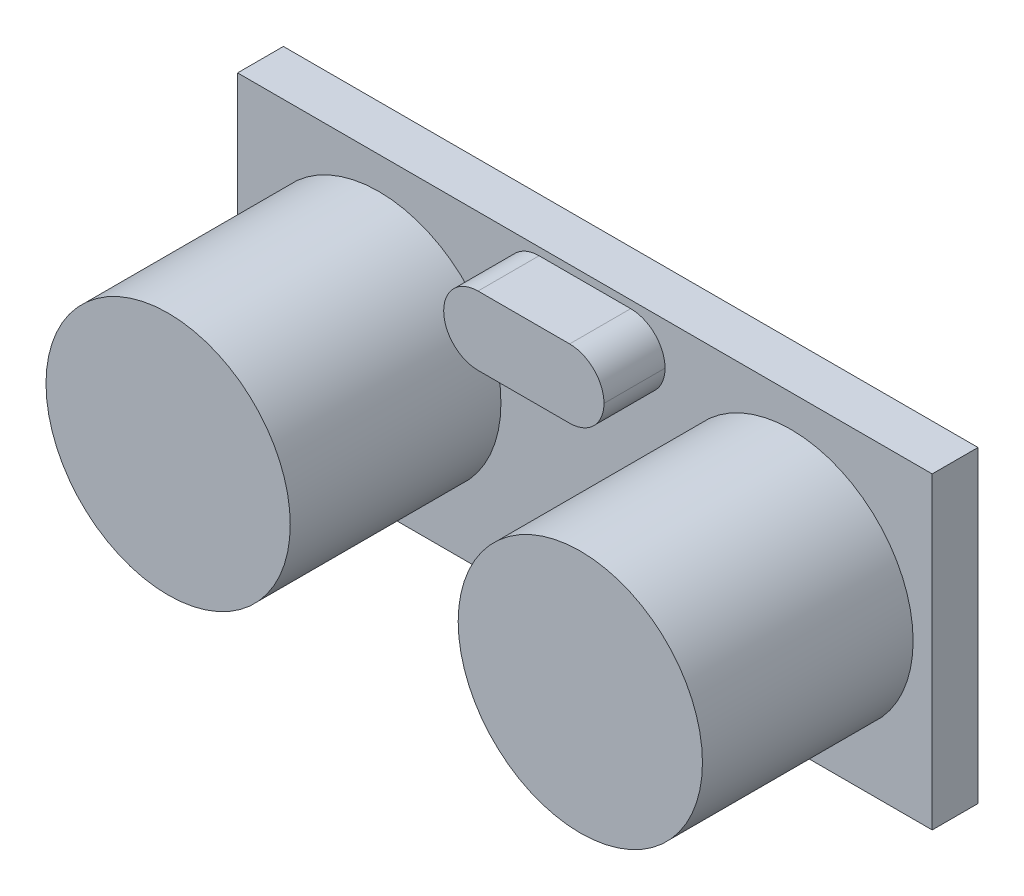
ISO-10303-21;
HEADER;
FILE_DESCRIPTION(('STEP AP214'),'2;1');
FILE_NAME('part.step','',(''),(''),'','','');
FILE_SCHEMA(('AUTOMOTIVE_DESIGN { 1 0 10303 214 1 1 1 1 }'));
ENDSEC;
DATA;
#1=APPLICATION_CONTEXT('core data for automotive mechanical design processes');
#2=APPLICATION_PROTOCOL_DEFINITION('international standard','automotive_design',2000,#1);
#3=PRODUCT_CONTEXT('',#1,'mechanical');
#4=PRODUCT('Part','Part','',(#3));
#5=PRODUCT_RELATED_PRODUCT_CATEGORY('part','',(#4));
#6=PRODUCT_DEFINITION_FORMATION('','',#4);
#7=PRODUCT_DEFINITION_CONTEXT('part definition',#1,'design');
#8=PRODUCT_DEFINITION('design','',#6,#7);
#9=PRODUCT_DEFINITION_SHAPE('','',#8);
#10=(LENGTH_UNIT() NAMED_UNIT(*) SI_UNIT(.MILLI.,.METRE.));
#11=(NAMED_UNIT(*) PLANE_ANGLE_UNIT() SI_UNIT($,.RADIAN.));
#12=(NAMED_UNIT(*) SI_UNIT($,.STERADIAN.) SOLID_ANGLE_UNIT());
#13=UNCERTAINTY_MEASURE_WITH_UNIT(LENGTH_MEASURE(1.E-05),#10,'distance_accuracy_value','');
#14=(GEOMETRIC_REPRESENTATION_CONTEXT(3) GLOBAL_UNCERTAINTY_ASSIGNED_CONTEXT((#13)) GLOBAL_UNIT_ASSIGNED_CONTEXT((#10,
#11,#12)) REPRESENTATION_CONTEXT('',''));
#15=CARTESIAN_POINT('',(0.,0.,0.));
#16=DIRECTION('',(0.,0.,1.));
#17=DIRECTION('',(1.,0.,0.));
#18=AXIS2_PLACEMENT_3D('',#15,#16,#17);
#19=CARTESIAN_POINT('',(0.,0.,3.));
#20=DIRECTION('',(0.,0.,1.));
#21=DIRECTION('',(1.,0.,0.));
#22=AXIS2_PLACEMENT_3D('',#19,#20,#21);
#23=PLANE('',#22);
#24=DIRECTION('',(0.,-1.,0.));
#25=VECTOR('',#24,1.);
#26=CARTESIAN_POINT('',(-5.08,0.,3.));
#27=LINE('',#26,#25);
#28=CARTESIAN_POINT('',(-5.08,-7.56,3.));
#29=VERTEX_POINT('',#28);
#30=CARTESIAN_POINT('',(-5.08,-10.1,3.));
#31=VERTEX_POINT('',#30);
#32=EDGE_CURVE('E210',#29,#31,#27,.T.);
#33=ORIENTED_EDGE('',*,*,#32,.F.);
#34=DIRECTION('',(-1.,0.,0.));
#35=VECTOR('',#34,1.);
#36=CARTESIAN_POINT('',(0.,-7.56,3.));
#37=LINE('',#36,#35);
#38=CARTESIAN_POINT('',(5.08,-7.56,3.));
#39=VERTEX_POINT('',#38);
#40=EDGE_CURVE('E49',#39,#29,#37,.T.);
#41=ORIENTED_EDGE('',*,*,#40,.F.);
#42=DIRECTION('',(0.,1.,0.));
#43=VECTOR('',#42,1.);
#44=CARTESIAN_POINT('',(5.08,0.,3.));
#45=LINE('',#44,#43);
#46=CARTESIAN_POINT('',(5.08,-10.1,3.));
#47=VERTEX_POINT('',#46);
#48=EDGE_CURVE('E53',#47,#39,#45,.T.);
#49=ORIENTED_EDGE('',*,*,#48,.F.);
#50=DIRECTION('',(1.,0.,0.));
#51=VECTOR('',#50,1.);
#52=CARTESIAN_POINT('',(-22.75,-10.1,3.));
#53=LINE('',#52,#51);
#54=CARTESIAN_POINT('',(22.75,-10.1,3.));
#55=VERTEX_POINT('',#54);
#56=EDGE_CURVE('E248',#47,#55,#53,.T.);
#57=ORIENTED_EDGE('',*,*,#56,.T.);
#58=DIRECTION('',(0.,1.,0.));
#59=VECTOR('',#58,1.);
#60=CARTESIAN_POINT('',(22.75,10.1,3.));
#61=LINE('',#60,#59);
#62=CARTESIAN_POINT('',(22.75,10.1,3.));
#63=VERTEX_POINT('',#62);
#64=EDGE_CURVE('E240',#55,#63,#61,.T.);
#65=ORIENTED_EDGE('',*,*,#64,.T.);
#66=DIRECTION('',(-1.,0.,0.));
#67=VECTOR('',#66,1.);
#68=CARTESIAN_POINT('',(-22.75,10.1,3.));
#69=LINE('',#68,#67);
#70=CARTESIAN_POINT('',(-22.75,10.1,3.));
#71=VERTEX_POINT('',#70);
#72=EDGE_CURVE('E243',#63,#71,#69,.T.);
#73=ORIENTED_EDGE('',*,*,#72,.T.);
#74=DIRECTION('',(0.,-1.,0.));
#75=VECTOR('',#74,1.);
#76=CARTESIAN_POINT('',(-22.75,10.1,3.));
#77=LINE('',#76,#75);
#78=CARTESIAN_POINT('',(-22.75,-10.1,3.));
#79=VERTEX_POINT('',#78);
#80=EDGE_CURVE('E246',#71,#79,#77,.T.);
#81=ORIENTED_EDGE('',*,*,#80,.T.);
#82=EDGE_CURVE('E249',#79,#31,#53,.T.);
#83=ORIENTED_EDGE('',*,*,#82,.T.);
#84=EDGE_LOOP('',(#33,#41,#49,#57,#65,#73,#81,#83));
#85=FACE_BOUND('',#84,.T.);
#86=CARTESIAN_POINT('',(13.5,0.,3.));
#87=DIRECTION('',(0.,0.,1.));
#88=DIRECTION('',(1.,0.,0.));
#89=AXIS2_PLACEMENT_3D('',#86,#87,#88);
#90=CIRCLE('',#89,8.);
#91=CARTESIAN_POINT('',(5.5,0.,3.));
#92=VERTEX_POINT('',#91);
#93=EDGE_CURVE('E221',#92,#92,#90,.T.);
#94=ORIENTED_EDGE('',*,*,#93,.F.);
#95=EDGE_LOOP('',(#94));
#96=FACE_BOUND('',#95,.T.);
#97=CARTESIAN_POINT('',(-13.5,0.,3.));
#98=DIRECTION('',(0.,0.,1.));
#99=DIRECTION('',(1.,0.,0.));
#100=AXIS2_PLACEMENT_3D('',#97,#98,#99);
#101=CIRCLE('',#100,8.);
#102=CARTESIAN_POINT('',(-21.5,0.,3.));
#103=VERTEX_POINT('',#102);
#104=EDGE_CURVE('E231',#103,#103,#101,.T.);
#105=ORIENTED_EDGE('',*,*,#104,.F.);
#106=EDGE_LOOP('',(#105));
#107=FACE_BOUND('',#106,.T.);
#108=DIRECTION('',(-1.,0.,0.));
#109=VECTOR('',#108,1.);
#110=CARTESIAN_POINT('',(-5.25,9.6,3.));
#111=LINE('',#110,#109);
#112=CARTESIAN_POINT('',(3.,9.6,3.));
#113=VERTEX_POINT('',#112);
#114=CARTESIAN_POINT('',(-3.,9.6,3.));
#115=VERTEX_POINT('',#114);
#116=EDGE_CURVE('E222',#113,#115,#111,.T.);
#117=ORIENTED_EDGE('',*,*,#116,.F.);
#118=CARTESIAN_POINT('',(3.,7.35,3.));
#119=DIRECTION('',(0.,0.,1.));
#120=DIRECTION('',(1.,0.,0.));
#121=AXIS2_PLACEMENT_3D('',#118,#119,#120);
#122=CIRCLE('',#121,2.25);
#123=CARTESIAN_POINT('',(5.25,7.35,3.));
#124=VERTEX_POINT('',#123);
#125=EDGE_CURVE('E296',#113,#124,#122,.F.);
#126=ORIENTED_EDGE('',*,*,#125,.T.);
#127=CARTESIAN_POINT('',(3.,7.35,3.));
#128=DIRECTION('',(0.,0.,1.));
#129=DIRECTION('',(1.,0.,0.));
#130=AXIS2_PLACEMENT_3D('',#127,#128,#129);
#131=CIRCLE('',#130,2.25);
#132=CARTESIAN_POINT('',(3.,5.1,3.));
#133=VERTEX_POINT('',#132);
#134=EDGE_CURVE('E294',#124,#133,#131,.F.);
#135=ORIENTED_EDGE('',*,*,#134,.T.);
#136=DIRECTION('',(1.,0.,0.));
#137=VECTOR('',#136,1.);
#138=CARTESIAN_POINT('',(-5.25,5.1,3.));
#139=LINE('',#138,#137);
#140=CARTESIAN_POINT('',(-3.,5.1,3.));
#141=VERTEX_POINT('',#140);
#142=EDGE_CURVE('E218',#141,#133,#139,.T.);
#143=ORIENTED_EDGE('',*,*,#142,.F.);
#144=CARTESIAN_POINT('',(-3.,7.35,3.));
#145=DIRECTION('',(0.,0.,1.));
#146=DIRECTION('',(1.,0.,0.));
#147=AXIS2_PLACEMENT_3D('',#144,#145,#146);
#148=CIRCLE('',#147,2.25);
#149=CARTESIAN_POINT('',(-5.25,7.35,3.));
#150=VERTEX_POINT('',#149);
#151=EDGE_CURVE('E290',#141,#150,#148,.F.);
#152=ORIENTED_EDGE('',*,*,#151,.T.);
#153=CARTESIAN_POINT('',(-3.,7.35,3.));
#154=DIRECTION('',(0.,0.,1.));
#155=DIRECTION('',(1.,0.,0.));
#156=AXIS2_PLACEMENT_3D('',#153,#154,#155);
#157=CIRCLE('',#156,2.25);
#158=EDGE_CURVE('E292',#150,#115,#157,.F.);
#159=ORIENTED_EDGE('',*,*,#158,.T.);
#160=EDGE_LOOP('',(#117,#126,#135,#143,#152,#159));
#161=FACE_BOUND('',#160,.T.);
#162=ADVANCED_FACE('F34',(#85,#96,#107,#161),#23,.T.);
#163=CARTESIAN_POINT('',(22.75,10.1,3.));
#164=DIRECTION('',(-1.,0.,0.));
#165=DIRECTION('',(0.,-1.,0.));
#166=AXIS2_PLACEMENT_3D('',#163,#164,#165);
#167=PLANE('',#166);
#168=DIRECTION('',(0.,1.,0.));
#169=VECTOR('',#168,1.);
#170=CARTESIAN_POINT('',(22.75,10.1,0.));
#171=LINE('',#170,#169);
#172=CARTESIAN_POINT('',(22.75,-10.1,0.));
#173=VERTEX_POINT('',#172);
#174=CARTESIAN_POINT('',(22.75,10.1,0.));
#175=VERTEX_POINT('',#174);
#176=EDGE_CURVE('E237',#173,#175,#171,.T.);
#177=ORIENTED_EDGE('',*,*,#176,.T.);
#178=DIRECTION('',(0.,0.,-1.));
#179=VECTOR('',#178,1.);
#180=CARTESIAN_POINT('',(22.75,10.1,3.));
#181=LINE('',#180,#179);
#182=EDGE_CURVE('E269',#63,#175,#181,.T.);
#183=ORIENTED_EDGE('',*,*,#182,.F.);
#184=ORIENTED_EDGE('',*,*,#64,.F.);
#185=DIRECTION('',(0.,0.,-1.));
#186=VECTOR('',#185,1.);
#187=CARTESIAN_POINT('',(22.75,-10.1,3.));
#188=LINE('',#187,#186);
#189=EDGE_CURVE('E251',#55,#173,#188,.T.);
#190=ORIENTED_EDGE('',*,*,#189,.T.);
#191=EDGE_LOOP('',(#177,#183,#184,#190));
#192=FACE_BOUND('',#191,.T.);
#193=ADVANCED_FACE('F338',(#192),#167,.F.);
#194=CARTESIAN_POINT('',(-22.75,10.1,3.));
#195=DIRECTION('',(0.,-1.,0.));
#196=DIRECTION('',(0.,0.,-1.));
#197=AXIS2_PLACEMENT_3D('',#194,#195,#196);
#198=PLANE('',#197);
#199=DIRECTION('',(-1.,0.,0.));
#200=VECTOR('',#199,1.);
#201=CARTESIAN_POINT('',(-22.75,10.1,0.));
#202=LINE('',#201,#200);
#203=CARTESIAN_POINT('',(-22.75,10.1,0.));
#204=VERTEX_POINT('',#203);
#205=EDGE_CURVE('E254',#175,#204,#202,.T.);
#206=ORIENTED_EDGE('',*,*,#205,.T.);
#207=DIRECTION('',(0.,0.,-1.));
#208=VECTOR('',#207,1.);
#209=CARTESIAN_POINT('',(-22.75,10.1,3.));
#210=LINE('',#209,#208);
#211=EDGE_CURVE('E266',#71,#204,#210,.T.);
#212=ORIENTED_EDGE('',*,*,#211,.F.);
#213=ORIENTED_EDGE('',*,*,#72,.F.);
#214=ORIENTED_EDGE('',*,*,#182,.T.);
#215=EDGE_LOOP('',(#206,#212,#213,#214));
#216=FACE_BOUND('',#215,.T.);
#217=ADVANCED_FACE('F340',(#216),#198,.F.);
#218=CARTESIAN_POINT('',(-22.75,10.1,3.));
#219=DIRECTION('',(1.,0.,0.));
#220=DIRECTION('',(0.,1.,0.));
#221=AXIS2_PLACEMENT_3D('',#218,#219,#220);
#222=PLANE('',#221);
#223=DIRECTION('',(0.,-1.,0.));
#224=VECTOR('',#223,1.);
#225=CARTESIAN_POINT('',(-22.75,10.1,0.));
#226=LINE('',#225,#224);
#227=CARTESIAN_POINT('',(-22.75,-10.1,0.));
#228=VERTEX_POINT('',#227);
#229=EDGE_CURVE('E256',#204,#228,#226,.T.);
#230=ORIENTED_EDGE('',*,*,#229,.T.);
#231=DIRECTION('',(0.,0.,-1.));
#232=VECTOR('',#231,1.);
#233=CARTESIAN_POINT('',(-22.75,-10.1,3.));
#234=LINE('',#233,#232);
#235=EDGE_CURVE('E263',#79,#228,#234,.T.);
#236=ORIENTED_EDGE('',*,*,#235,.F.);
#237=ORIENTED_EDGE('',*,*,#80,.F.);
#238=ORIENTED_EDGE('',*,*,#211,.T.);
#239=EDGE_LOOP('',(#230,#236,#237,#238));
#240=FACE_BOUND('',#239,.T.);
#241=ADVANCED_FACE('F318',(#240),#222,.F.);
#242=CARTESIAN_POINT('',(-22.75,-10.1,3.));
#243=DIRECTION('',(0.,1.,0.));
#244=DIRECTION('',(0.,0.,1.));
#245=AXIS2_PLACEMENT_3D('',#242,#243,#244);
#246=PLANE('',#245);
#247=ORIENTED_EDGE('',*,*,#56,.F.);
#248=DIRECTION('',(0.,0.,-1.));
#249=VECTOR('',#248,1.);
#250=CARTESIAN_POINT('',(5.08,-10.1,5.));
#251=LINE('',#250,#249);
#252=CARTESIAN_POINT('',(5.08,-10.1,5.));
#253=VERTEX_POINT('',#252);
#254=EDGE_CURVE('E200',#253,#47,#251,.T.);
#255=ORIENTED_EDGE('',*,*,#254,.F.);
#256=DIRECTION('',(-1.,0.,0.));
#257=VECTOR('',#256,1.);
#258=CARTESIAN_POINT('',(5.08,-10.1,5.));
#259=LINE('',#258,#257);
#260=CARTESIAN_POINT('',(-5.08,-10.1,5.));
#261=VERTEX_POINT('',#260);
#262=EDGE_CURVE('E165',#253,#261,#259,.T.);
#263=ORIENTED_EDGE('',*,*,#262,.T.);
#264=DIRECTION('',(0.,0.,-1.));
#265=VECTOR('',#264,1.);
#266=CARTESIAN_POINT('',(-5.08,-10.1,5.));
#267=LINE('',#266,#265);
#268=EDGE_CURVE('E196',#261,#31,#267,.T.);
#269=ORIENTED_EDGE('',*,*,#268,.T.);
#270=ORIENTED_EDGE('',*,*,#82,.F.);
#271=ORIENTED_EDGE('',*,*,#235,.T.);
#272=DIRECTION('',(1.,0.,0.));
#273=VECTOR('',#272,1.);
#274=CARTESIAN_POINT('',(-22.75,-10.1,0.));
#275=LINE('',#274,#273);
#276=CARTESIAN_POINT('',(-5.08,-10.1,0.));
#277=VERTEX_POINT('',#276);
#278=EDGE_CURVE('E244',#228,#277,#275,.T.);
#279=ORIENTED_EDGE('',*,*,#278,.T.);
#280=CARTESIAN_POINT('',(-5.08,-10.1,-10.));
#281=VERTEX_POINT('',#280);
#282=EDGE_CURVE('E199',#277,#281,#267,.T.);
#283=ORIENTED_EDGE('',*,*,#282,.T.);
#284=DIRECTION('',(-1.,0.,0.));
#285=VECTOR('',#284,1.);
#286=CARTESIAN_POINT('',(5.08,-10.1,-10.));
#287=LINE('',#286,#285);
#288=CARTESIAN_POINT('',(5.08,-10.1,-10.));
#289=VERTEX_POINT('',#288);
#290=EDGE_CURVE('E180',#289,#281,#287,.T.);
#291=ORIENTED_EDGE('',*,*,#290,.F.);
#292=CARTESIAN_POINT('',(5.08,-10.1,0.));
#293=VERTEX_POINT('',#292);
#294=EDGE_CURVE('E203',#293,#289,#251,.T.);
#295=ORIENTED_EDGE('',*,*,#294,.F.);
#296=EDGE_CURVE('E258',#293,#173,#275,.T.);
#297=ORIENTED_EDGE('',*,*,#296,.T.);
#298=ORIENTED_EDGE('',*,*,#189,.F.);
#299=EDGE_LOOP('',(#247,#255,#263,#269,#270,#271,#279,#283,#291,#295,#297,#298));
#300=FACE_BOUND('',#299,.T.);
#301=ADVANCED_FACE('F312',(#300),#246,.F.);
#302=CARTESIAN_POINT('',(0.,0.,0.));
#303=DIRECTION('',(0.,0.,1.));
#304=DIRECTION('',(1.,0.,0.));
#305=AXIS2_PLACEMENT_3D('',#302,#303,#304);
#306=PLANE('',#305);
#307=DIRECTION('',(-1.,0.,0.));
#308=VECTOR('',#307,1.);
#309=CARTESIAN_POINT('',(0.,-7.56,0.));
#310=LINE('',#309,#308);
#311=CARTESIAN_POINT('',(5.08,-7.56,0.));
#312=VERTEX_POINT('',#311);
#313=CARTESIAN_POINT('',(-5.08,-7.56,0.));
#314=VERTEX_POINT('',#313);
#315=EDGE_CURVE('E298',#312,#314,#310,.T.);
#316=ORIENTED_EDGE('',*,*,#315,.T.);
#317=DIRECTION('',(0.,-1.,0.));
#318=VECTOR('',#317,1.);
#319=CARTESIAN_POINT('',(-5.08,0.,0.));
#320=LINE('',#319,#318);
#321=EDGE_CURVE('E11',#314,#277,#320,.T.);
#322=ORIENTED_EDGE('',*,*,#321,.T.);
#323=ORIENTED_EDGE('',*,*,#278,.F.);
#324=ORIENTED_EDGE('',*,*,#229,.F.);
#325=ORIENTED_EDGE('',*,*,#205,.F.);
#326=ORIENTED_EDGE('',*,*,#176,.F.);
#327=ORIENTED_EDGE('',*,*,#296,.F.);
#328=DIRECTION('',(0.,1.,0.));
#329=VECTOR('',#328,1.);
#330=CARTESIAN_POINT('',(5.08,0.,0.));
#331=LINE('',#330,#329);
#332=EDGE_CURVE('E42',#293,#312,#331,.T.);
#333=ORIENTED_EDGE('',*,*,#332,.T.);
#334=EDGE_LOOP('',(#316,#322,#323,#324,#325,#326,#327,#333));
#335=FACE_BOUND('',#334,.T.);
#336=ADVANCED_FACE('F306',(#335),#306,.F.);
#337=CARTESIAN_POINT('',(-13.5,0.,16.8));
#338=DIRECTION('',(0.,0.,-1.));
#339=DIRECTION('',(-1.,0.,0.));
#340=AXIS2_PLACEMENT_3D('',#337,#338,#339);
#341=CYLINDRICAL_SURFACE('',#340,8.);
#342=CARTESIAN_POINT('',(-13.5,0.,16.8));
#343=DIRECTION('',(0.,0.,1.));
#344=DIRECTION('',(1.,0.,0.));
#345=AXIS2_PLACEMENT_3D('',#342,#343,#344);
#346=CIRCLE('',#345,8.);
#347=CARTESIAN_POINT('',(-21.5,0.,16.8));
#348=VERTEX_POINT('',#347);
#349=EDGE_CURVE('E234',#348,#348,#346,.T.);
#350=CARTESIAN_POINT('',(-21.5,0.,16.8));
#351=CARTESIAN_POINT('',(-21.5,0.,16.65625));
#352=CARTESIAN_POINT('',(-21.5,0.,16.5125));
#353=CARTESIAN_POINT('',(-21.5,0.,16.225));
#354=CARTESIAN_POINT('',(-21.5,0.,16.08125));
#355=CARTESIAN_POINT('',(-21.5,0.,15.79375));
#356=CARTESIAN_POINT('',(-21.5,0.,15.65));
#357=CARTESIAN_POINT('',(-21.5,0.,15.3625));
#358=CARTESIAN_POINT('',(-21.5,0.,15.21875));
#359=CARTESIAN_POINT('',(-21.5,0.,14.93125));
#360=CARTESIAN_POINT('',(-21.5,0.,14.7875));
#361=CARTESIAN_POINT('',(-21.5,0.,14.5));
#362=CARTESIAN_POINT('',(-21.5,0.,14.35625));
#363=CARTESIAN_POINT('',(-21.5,0.,14.06875));
#364=CARTESIAN_POINT('',(-21.5,0.,13.925));
#365=CARTESIAN_POINT('',(-21.5,0.,13.6375));
#366=CARTESIAN_POINT('',(-21.5,0.,13.49375));
#367=CARTESIAN_POINT('',(-21.5,0.,13.20625));
#368=CARTESIAN_POINT('',(-21.5,0.,13.0625));
#369=CARTESIAN_POINT('',(-21.5,0.,12.775));
#370=CARTESIAN_POINT('',(-21.5,0.,12.63125));
#371=CARTESIAN_POINT('',(-21.5,0.,12.34375));
#372=CARTESIAN_POINT('',(-21.5,0.,12.2));
#373=CARTESIAN_POINT('',(-21.5,0.,11.9125));
#374=CARTESIAN_POINT('',(-21.5,0.,11.76875));
#375=CARTESIAN_POINT('',(-21.5,0.,11.48125));
#376=CARTESIAN_POINT('',(-21.5,0.,11.3375));
#377=CARTESIAN_POINT('',(-21.5,0.,11.05));
#378=CARTESIAN_POINT('',(-21.5,0.,10.90625));
#379=CARTESIAN_POINT('',(-21.5,0.,10.61875));
#380=CARTESIAN_POINT('',(-21.5,0.,10.475));
#381=CARTESIAN_POINT('',(-21.5,0.,10.1875));
#382=CARTESIAN_POINT('',(-21.5,0.,10.04375));
#383=CARTESIAN_POINT('',(-21.5,0.,9.75625));
#384=CARTESIAN_POINT('',(-21.5,0.,9.6125));
#385=CARTESIAN_POINT('',(-21.5,0.,9.325));
#386=CARTESIAN_POINT('',(-21.5,0.,9.18125));
#387=CARTESIAN_POINT('',(-21.5,0.,8.89375));
#388=CARTESIAN_POINT('',(-21.5,0.,8.75));
#389=CARTESIAN_POINT('',(-21.5,0.,8.4625));
#390=CARTESIAN_POINT('',(-21.5,0.,8.31875));
#391=CARTESIAN_POINT('',(-21.5,0.,8.03125));
#392=CARTESIAN_POINT('',(-21.5,0.,7.8875));
#393=CARTESIAN_POINT('',(-21.5,0.,7.6));
#394=CARTESIAN_POINT('',(-21.5,0.,7.45625));
#395=CARTESIAN_POINT('',(-21.5,0.,7.16875));
#396=CARTESIAN_POINT('',(-21.5,0.,7.025));
#397=CARTESIAN_POINT('',(-21.5,0.,6.7375));
#398=CARTESIAN_POINT('',(-21.5,0.,6.59375));
#399=CARTESIAN_POINT('',(-21.5,0.,6.30625));
#400=CARTESIAN_POINT('',(-21.5,0.,6.1625));
#401=CARTESIAN_POINT('',(-21.5,0.,5.875));
#402=CARTESIAN_POINT('',(-21.5,0.,5.73125));
#403=CARTESIAN_POINT('',(-21.5,0.,5.44375));
#404=CARTESIAN_POINT('',(-21.5,0.,5.3));
#405=CARTESIAN_POINT('',(-21.5,0.,5.0125));
#406=CARTESIAN_POINT('',(-21.5,0.,4.86875));
#407=CARTESIAN_POINT('',(-21.5,0.,4.58125));
#408=CARTESIAN_POINT('',(-21.5,0.,4.4375));
#409=CARTESIAN_POINT('',(-21.5,0.,4.15));
#410=CARTESIAN_POINT('',(-21.5,0.,4.00625));
#411=CARTESIAN_POINT('',(-21.5,0.,3.71875));
#412=CARTESIAN_POINT('',(-21.5,0.,3.575));
#413=CARTESIAN_POINT('',(-21.5,0.,3.2875));
#414=CARTESIAN_POINT('',(-21.5,0.,3.14375));
#415=CARTESIAN_POINT('',(-21.5,0.,3.));
#416=B_SPLINE_CURVE_WITH_KNOTS('',3,(#350,#351,#352,#353,#354,#355,#356,#357,#358,#359,#360,
#361,#362,#363,#364,#365,#366,#367,#368,#369,#370,#371,#372,#373,#374,#375,#376,#377,#378,#379,
#380,#381,#382,#383,#384,#385,#386,#387,#388,#389,#390,#391,#392,#393,#394,#395,#396,#397,#398,
#399,#400,#401,#402,#403,#404,#405,#406,#407,#408,#409,#410,#411,#412,#413,#414,#415),
.UNSPECIFIED.,.F.,.F.,(4,2,2,2,2,2,2,2,2,2,2,2,2,2,2,2,2,2,2,2,2,2,2,2,2,2,2,2,2,2,2,2,4),(0.,
0.431249999999998,0.862499999999999,1.29375,1.725,2.15625,2.5875,3.01875,3.45,3.88125,4.3125,
4.74375,5.175,5.60625,6.0375,6.46875,6.9,7.33125,7.7625,8.19375,8.625,9.05625,9.4875,9.91875,
10.35,10.78125,11.2125,11.64375,12.075,12.50625,12.9375,13.36875,13.8),.UNSPECIFIED.);
#417=EDGE_CURVE('BSEAM355',#348,#103,#416,.T.);
#418=ORIENTED_EDGE('',*,*,#349,.F.);
#419=ORIENTED_EDGE('',*,*,#104,.T.);
#420=ORIENTED_EDGE('',*,*,#417,.T.);
#421=ORIENTED_EDGE('',*,*,#417,.F.);
#422=EDGE_LOOP('',(#418,#420,#419,#421));
#423=FACE_BOUND('',#422,.T.);
#424=ADVANCED_FACE('F355',(#423),#341,.T.);
#425=CARTESIAN_POINT('',(-13.5,0.,16.8));
#426=DIRECTION('',(0.,0.,1.));
#427=DIRECTION('',(1.,0.,0.));
#428=AXIS2_PLACEMENT_3D('',#425,#426,#427);
#429=PLANE('',#428);
#430=ORIENTED_EDGE('',*,*,#349,.T.);
#431=EDGE_LOOP('',(#430));
#432=FACE_BOUND('',#431,.T.);
#433=ADVANCED_FACE('F375',(#432),#429,.T.);
#434=CARTESIAN_POINT('',(13.5,0.,16.8));
#435=DIRECTION('',(0.,0.,-1.));
#436=DIRECTION('',(-1.,0.,0.));
#437=AXIS2_PLACEMENT_3D('',#434,#435,#436);
#438=CYLINDRICAL_SURFACE('',#437,8.);
#439=CARTESIAN_POINT('',(13.5,0.,16.8));
#440=DIRECTION('',(0.,0.,1.));
#441=DIRECTION('',(1.,0.,0.));
#442=AXIS2_PLACEMENT_3D('',#439,#440,#441);
#443=CIRCLE('',#442,8.);
#444=CARTESIAN_POINT('',(5.5,0.,16.8));
#445=VERTEX_POINT('',#444);
#446=EDGE_CURVE('E228',#445,#445,#443,.T.);
#447=CARTESIAN_POINT('',(5.5,0.,16.8));
#448=CARTESIAN_POINT('',(5.5,0.,16.65625));
#449=CARTESIAN_POINT('',(5.5,0.,16.5125));
#450=CARTESIAN_POINT('',(5.5,0.,16.225));
#451=CARTESIAN_POINT('',(5.5,0.,16.08125));
#452=CARTESIAN_POINT('',(5.5,0.,15.79375));
#453=CARTESIAN_POINT('',(5.5,0.,15.65));
#454=CARTESIAN_POINT('',(5.5,0.,15.3625));
#455=CARTESIAN_POINT('',(5.5,0.,15.21875));
#456=CARTESIAN_POINT('',(5.5,0.,14.93125));
#457=CARTESIAN_POINT('',(5.5,0.,14.7875));
#458=CARTESIAN_POINT('',(5.5,0.,14.5));
#459=CARTESIAN_POINT('',(5.5,0.,14.35625));
#460=CARTESIAN_POINT('',(5.5,0.,14.06875));
#461=CARTESIAN_POINT('',(5.5,0.,13.925));
#462=CARTESIAN_POINT('',(5.5,0.,13.6375));
#463=CARTESIAN_POINT('',(5.5,0.,13.49375));
#464=CARTESIAN_POINT('',(5.5,0.,13.20625));
#465=CARTESIAN_POINT('',(5.5,0.,13.0625));
#466=CARTESIAN_POINT('',(5.5,0.,12.775));
#467=CARTESIAN_POINT('',(5.5,0.,12.63125));
#468=CARTESIAN_POINT('',(5.5,0.,12.34375));
#469=CARTESIAN_POINT('',(5.5,0.,12.2));
#470=CARTESIAN_POINT('',(5.5,0.,11.9125));
#471=CARTESIAN_POINT('',(5.5,0.,11.76875));
#472=CARTESIAN_POINT('',(5.5,0.,11.48125));
#473=CARTESIAN_POINT('',(5.5,0.,11.3375));
#474=CARTESIAN_POINT('',(5.5,0.,11.05));
#475=CARTESIAN_POINT('',(5.5,0.,10.90625));
#476=CARTESIAN_POINT('',(5.5,0.,10.61875));
#477=CARTESIAN_POINT('',(5.5,0.,10.475));
#478=CARTESIAN_POINT('',(5.5,0.,10.1875));
#479=CARTESIAN_POINT('',(5.5,0.,10.04375));
#480=CARTESIAN_POINT('',(5.5,0.,9.75625));
#481=CARTESIAN_POINT('',(5.5,0.,9.6125));
#482=CARTESIAN_POINT('',(5.5,0.,9.325));
#483=CARTESIAN_POINT('',(5.5,0.,9.18125));
#484=CARTESIAN_POINT('',(5.5,0.,8.89375));
#485=CARTESIAN_POINT('',(5.5,0.,8.75));
#486=CARTESIAN_POINT('',(5.5,0.,8.4625));
#487=CARTESIAN_POINT('',(5.5,0.,8.31875));
#488=CARTESIAN_POINT('',(5.5,0.,8.03125));
#489=CARTESIAN_POINT('',(5.5,0.,7.8875));
#490=CARTESIAN_POINT('',(5.5,0.,7.6));
#491=CARTESIAN_POINT('',(5.5,0.,7.45625));
#492=CARTESIAN_POINT('',(5.5,0.,7.16875));
#493=CARTESIAN_POINT('',(5.5,0.,7.025));
#494=CARTESIAN_POINT('',(5.5,0.,6.7375));
#495=CARTESIAN_POINT('',(5.5,0.,6.59375));
#496=CARTESIAN_POINT('',(5.5,0.,6.30625));
#497=CARTESIAN_POINT('',(5.5,0.,6.1625));
#498=CARTESIAN_POINT('',(5.5,0.,5.875));
#499=CARTESIAN_POINT('',(5.5,0.,5.73125));
#500=CARTESIAN_POINT('',(5.5,0.,5.44375));
#501=CARTESIAN_POINT('',(5.5,0.,5.3));
#502=CARTESIAN_POINT('',(5.5,0.,5.0125));
#503=CARTESIAN_POINT('',(5.5,0.,4.86875));
#504=CARTESIAN_POINT('',(5.5,0.,4.58125));
#505=CARTESIAN_POINT('',(5.5,0.,4.4375));
#506=CARTESIAN_POINT('',(5.5,0.,4.15));
#507=CARTESIAN_POINT('',(5.5,0.,4.00625));
#508=CARTESIAN_POINT('',(5.5,0.,3.71875));
#509=CARTESIAN_POINT('',(5.5,0.,3.575));
#510=CARTESIAN_POINT('',(5.5,0.,3.2875));
#511=CARTESIAN_POINT('',(5.5,0.,3.14375));
#512=CARTESIAN_POINT('',(5.5,0.,3.));
#513=B_SPLINE_CURVE_WITH_KNOTS('',3,(#447,#448,#449,#450,#451,#452,#453,#454,#455,#456,#457,
#458,#459,#460,#461,#462,#463,#464,#465,#466,#467,#468,#469,#470,#471,#472,#473,#474,#475,#476,
#477,#478,#479,#480,#481,#482,#483,#484,#485,#486,#487,#488,#489,#490,#491,#492,#493,#494,#495,
#496,#497,#498,#499,#500,#501,#502,#503,#504,#505,#506,#507,#508,#509,#510,#511,#512),
.UNSPECIFIED.,.F.,.F.,(4,2,2,2,2,2,2,2,2,2,2,2,2,2,2,2,2,2,2,2,2,2,2,2,2,2,2,2,2,2,2,2,4),(0.,
0.431249999999998,0.862499999999999,1.29375,1.725,2.15625,2.5875,3.01875,3.45,3.88125,4.3125,
4.74375,5.175,5.60625,6.0375,6.46875,6.9,7.33125,7.7625,8.19375,8.625,9.05625,9.4875,9.91875,
10.35,10.78125,11.2125,11.64375,12.075,12.50625,12.9375,13.36875,13.8),.UNSPECIFIED.);
#514=EDGE_CURVE('BSEAM382',#445,#92,#513,.T.);
#515=ORIENTED_EDGE('',*,*,#446,.F.);
#516=ORIENTED_EDGE('',*,*,#93,.T.);
#517=ORIENTED_EDGE('',*,*,#514,.T.);
#518=ORIENTED_EDGE('',*,*,#514,.F.);
#519=EDGE_LOOP('',(#515,#517,#516,#518));
#520=FACE_BOUND('',#519,.T.);
#521=ADVANCED_FACE('F382',(#520),#438,.T.);
#522=CARTESIAN_POINT('',(13.5,0.,16.8));
#523=DIRECTION('',(0.,0.,1.));
#524=DIRECTION('',(1.,0.,0.));
#525=AXIS2_PLACEMENT_3D('',#522,#523,#524);
#526=PLANE('',#525);
#527=ORIENTED_EDGE('',*,*,#446,.T.);
#528=EDGE_LOOP('',(#527));
#529=FACE_BOUND('',#528,.T.);
#530=ADVANCED_FACE('F389',(#529),#526,.T.);
#531=CARTESIAN_POINT('',(-5.25,9.6,7.));
#532=DIRECTION('',(0.,-1.,0.));
#533=DIRECTION('',(0.,0.,-1.));
#534=AXIS2_PLACEMENT_3D('',#531,#532,#533);
#535=PLANE('',#534);
#536=ORIENTED_EDGE('',*,*,#116,.T.);
#537=DIRECTION('',(0.,0.,-1.));
#538=VECTOR('',#537,1.);
#539=CARTESIAN_POINT('',(-3.,9.6,7.));
#540=LINE('',#539,#538);
#541=CARTESIAN_POINT('',(-3.,9.6,7.));
#542=VERTEX_POINT('',#541);
#543=EDGE_CURVE('E288',#115,#542,#540,.F.);
#544=ORIENTED_EDGE('',*,*,#543,.T.);
#545=DIRECTION('',(-1.,0.,0.));
#546=VECTOR('',#545,1.);
#547=CARTESIAN_POINT('',(-5.25,9.6,7.));
#548=LINE('',#547,#546);
#549=CARTESIAN_POINT('',(3.,9.6,7.));
#550=VERTEX_POINT('',#549);
#551=EDGE_CURVE('E214',#550,#542,#548,.T.);
#552=ORIENTED_EDGE('',*,*,#551,.F.);
#553=DIRECTION('',(0.,0.,-1.));
#554=VECTOR('',#553,1.);
#555=CARTESIAN_POINT('',(3.,9.6,7.));
#556=LINE('',#555,#554);
#557=EDGE_CURVE('E286',#550,#113,#556,.T.);
#558=ORIENTED_EDGE('',*,*,#557,.T.);
#559=EDGE_LOOP('',(#536,#544,#552,#558));
#560=FACE_BOUND('',#559,.T.);
#561=ADVANCED_FACE('F397',(#560),#535,.F.);
#562=CARTESIAN_POINT('',(-5.25,5.1,7.));
#563=DIRECTION('',(0.,1.,0.));
#564=DIRECTION('',(0.,0.,1.));
#565=AXIS2_PLACEMENT_3D('',#562,#563,#564);
#566=PLANE('',#565);
#567=DIRECTION('',(1.,0.,0.));
#568=VECTOR('',#567,1.);
#569=CARTESIAN_POINT('',(-5.25,5.1,7.));
#570=LINE('',#569,#568);
#571=CARTESIAN_POINT('',(-3.,5.1,7.));
#572=VERTEX_POINT('',#571);
#573=CARTESIAN_POINT('',(3.,5.1,7.));
#574=VERTEX_POINT('',#573);
#575=EDGE_CURVE('E217',#572,#574,#570,.T.);
#576=ORIENTED_EDGE('',*,*,#575,.F.);
#577=DIRECTION('',(0.,0.,-1.));
#578=VECTOR('',#577,1.);
#579=CARTESIAN_POINT('',(-3.,5.1,7.));
#580=LINE('',#579,#578);
#581=EDGE_CURVE('E275',#572,#141,#580,.T.);
#582=ORIENTED_EDGE('',*,*,#581,.T.);
#583=ORIENTED_EDGE('',*,*,#142,.T.);
#584=DIRECTION('',(0.,0.,-1.));
#585=VECTOR('',#584,1.);
#586=CARTESIAN_POINT('',(3.,5.1,7.));
#587=LINE('',#586,#585);
#588=EDGE_CURVE('E272',#133,#574,#587,.F.);
#589=ORIENTED_EDGE('',*,*,#588,.T.);
#590=EDGE_LOOP('',(#576,#582,#583,#589));
#591=FACE_BOUND('',#590,.T.);
#592=ADVANCED_FACE('F405',(#591),#566,.F.);
#593=CARTESIAN_POINT('',(0.,0.,7.));
#594=DIRECTION('',(0.,0.,1.));
#595=DIRECTION('',(1.,0.,0.));
#596=AXIS2_PLACEMENT_3D('',#593,#594,#595);
#597=PLANE('',#596);
#598=CARTESIAN_POINT('',(-3.,7.35,7.));
#599=DIRECTION('',(0.,0.,1.));
#600=DIRECTION('',(1.,0.,0.));
#601=AXIS2_PLACEMENT_3D('',#598,#599,#600);
#602=CIRCLE('',#601,2.25);
#603=CARTESIAN_POINT('',(-5.25,7.35,7.));
#604=VERTEX_POINT('',#603);
#605=EDGE_CURVE('E282',#542,#604,#602,.T.);
#606=ORIENTED_EDGE('',*,*,#605,.T.);
#607=CARTESIAN_POINT('',(-3.,7.35,7.));
#608=DIRECTION('',(0.,0.,1.));
#609=DIRECTION('',(1.,0.,0.));
#610=AXIS2_PLACEMENT_3D('',#607,#608,#609);
#611=CIRCLE('',#610,2.25);
#612=EDGE_CURVE('E284',#604,#572,#611,.T.);
#613=ORIENTED_EDGE('',*,*,#612,.T.);
#614=ORIENTED_EDGE('',*,*,#575,.T.);
#615=CARTESIAN_POINT('',(3.,7.35,7.));
#616=DIRECTION('',(0.,0.,1.));
#617=DIRECTION('',(1.,0.,0.));
#618=AXIS2_PLACEMENT_3D('',#615,#616,#617);
#619=CIRCLE('',#618,2.25);
#620=CARTESIAN_POINT('',(5.25,7.35,7.));
#621=VERTEX_POINT('',#620);
#622=EDGE_CURVE('E280',#574,#621,#619,.T.);
#623=ORIENTED_EDGE('',*,*,#622,.T.);
#624=CARTESIAN_POINT('',(3.,7.35,7.));
#625=DIRECTION('',(0.,0.,1.));
#626=DIRECTION('',(1.,0.,0.));
#627=AXIS2_PLACEMENT_3D('',#624,#625,#626);
#628=CIRCLE('',#627,2.25);
#629=EDGE_CURVE('E278',#621,#550,#628,.T.);
#630=ORIENTED_EDGE('',*,*,#629,.T.);
#631=ORIENTED_EDGE('',*,*,#551,.T.);
#632=EDGE_LOOP('',(#606,#613,#614,#623,#630,#631));
#633=FACE_BOUND('',#632,.T.);
#634=ADVANCED_FACE('F413',(#633),#597,.T.);
#635=CARTESIAN_POINT('',(-3.,7.35,7.));
#636=DIRECTION('',(0.,0.,-1.));
#637=DIRECTION('',(-1.,0.,0.));
#638=AXIS2_PLACEMENT_3D('',#635,#636,#637);
#639=CYLINDRICAL_SURFACE('',#638,2.25);
#640=DIRECTION('',(0.,0.,-1.));
#641=VECTOR('',#640,1.);
#642=CARTESIAN_POINT('',(-5.25,7.35,7.));
#643=LINE('',#642,#641);
#644=EDGE_CURVE('E225',#604,#150,#643,.T.);
#645=ORIENTED_EDGE('',*,*,#644,.F.);
#646=ORIENTED_EDGE('',*,*,#605,.F.);
#647=ORIENTED_EDGE('',*,*,#543,.F.);
#648=ORIENTED_EDGE('',*,*,#158,.F.);
#649=EDGE_LOOP('',(#645,#646,#647,#648));
#650=FACE_BOUND('',#649,.T.);
#651=ADVANCED_FACE('F421',(#650),#639,.T.);
#652=CARTESIAN_POINT('',(-3.,7.35,7.));
#653=DIRECTION('',(0.,0.,-1.));
#654=DIRECTION('',(-1.,0.,0.));
#655=AXIS2_PLACEMENT_3D('',#652,#653,#654);
#656=CYLINDRICAL_SURFACE('',#655,2.25);
#657=ORIENTED_EDGE('',*,*,#612,.F.);
#658=ORIENTED_EDGE('',*,*,#644,.T.);
#659=ORIENTED_EDGE('',*,*,#151,.F.);
#660=ORIENTED_EDGE('',*,*,#581,.F.);
#661=EDGE_LOOP('',(#657,#658,#659,#660));
#662=FACE_BOUND('',#661,.T.);
#663=ADVANCED_FACE('F429',(#662),#656,.T.);
#664=CARTESIAN_POINT('',(3.,7.35,7.));
#665=DIRECTION('',(0.,0.,-1.));
#666=DIRECTION('',(-1.,0.,0.));
#667=AXIS2_PLACEMENT_3D('',#664,#665,#666);
#668=CYLINDRICAL_SURFACE('',#667,2.25);
#669=ORIENTED_EDGE('',*,*,#557,.F.);
#670=ORIENTED_EDGE('',*,*,#629,.F.);
#671=DIRECTION('',(0.,0.,-1.));
#672=VECTOR('',#671,1.);
#673=CARTESIAN_POINT('',(5.25,7.35,7.));
#674=LINE('',#673,#672);
#675=EDGE_CURVE('E213',#124,#621,#674,.F.);
#676=ORIENTED_EDGE('',*,*,#675,.F.);
#677=ORIENTED_EDGE('',*,*,#125,.F.);
#678=EDGE_LOOP('',(#669,#670,#676,#677));
#679=FACE_BOUND('',#678,.T.);
#680=ADVANCED_FACE('F36',(#679),#668,.T.);
#681=CARTESIAN_POINT('',(3.,7.35,7.));
#682=DIRECTION('',(0.,0.,-1.));
#683=DIRECTION('',(-1.,0.,0.));
#684=AXIS2_PLACEMENT_3D('',#681,#682,#683);
#685=CYLINDRICAL_SURFACE('',#684,2.25);
#686=ORIENTED_EDGE('',*,*,#622,.F.);
#687=ORIENTED_EDGE('',*,*,#588,.F.);
#688=ORIENTED_EDGE('',*,*,#134,.F.);
#689=ORIENTED_EDGE('',*,*,#675,.T.);
#690=EDGE_LOOP('',(#686,#687,#688,#689));
#691=FACE_BOUND('',#690,.T.);
#692=ADVANCED_FACE('F444',(#691),#685,.T.);
#693=CARTESIAN_POINT('',(0.,0.,-10.));
#694=DIRECTION('',(0.,0.,-1.));
#695=DIRECTION('',(-1.,0.,0.));
#696=AXIS2_PLACEMENT_3D('',#693,#694,#695);
#697=PLANE('',#696);
#698=DIRECTION('',(0.,1.,0.));
#699=VECTOR('',#698,1.);
#700=CARTESIAN_POINT('',(-5.08,-7.56,-10.));
#701=LINE('',#700,#699);
#702=CARTESIAN_POINT('',(-5.08,-7.56,-10.));
#703=VERTEX_POINT('',#702);
#704=EDGE_CURVE('E161',#281,#703,#701,.T.);
#705=ORIENTED_EDGE('',*,*,#704,.T.);
#706=DIRECTION('',(1.,0.,0.));
#707=VECTOR('',#706,1.);
#708=CARTESIAN_POINT('',(5.08,-7.56,-10.));
#709=LINE('',#708,#707);
#710=CARTESIAN_POINT('',(5.08,-7.56,-10.));
#711=VERTEX_POINT('',#710);
#712=EDGE_CURVE('E168',#703,#711,#709,.T.);
#713=ORIENTED_EDGE('',*,*,#712,.T.);
#714=DIRECTION('',(0.,-1.,0.));
#715=VECTOR('',#714,1.);
#716=CARTESIAN_POINT('',(5.08,-7.56,-10.));
#717=LINE('',#716,#715);
#718=EDGE_CURVE('E175',#711,#289,#717,.T.);
#719=ORIENTED_EDGE('',*,*,#718,.T.);
#720=ORIENTED_EDGE('',*,*,#290,.T.);
#721=EDGE_LOOP('',(#705,#713,#719,#720));
#722=FACE_BOUND('',#721,.T.);
#723=ADVANCED_FACE('F178',(#722),#697,.T.);
#724=CARTESIAN_POINT('',(5.08,-7.56,5.));
#725=DIRECTION('',(0.,1.,0.));
#726=DIRECTION('',(0.,0.,1.));
#727=AXIS2_PLACEMENT_3D('',#724,#725,#726);
#728=PLANE('',#727);
#729=ORIENTED_EDGE('',*,*,#315,.F.);
#730=DIRECTION('',(0.,0.,-1.));
#731=VECTOR('',#730,1.);
#732=CARTESIAN_POINT('',(5.08,-7.56,5.));
#733=LINE('',#732,#731);
#734=EDGE_CURVE('E171',#312,#711,#733,.T.);
#735=ORIENTED_EDGE('',*,*,#734,.T.);
#736=ORIENTED_EDGE('',*,*,#712,.F.);
#737=DIRECTION('',(0.,0.,-1.));
#738=VECTOR('',#737,1.);
#739=CARTESIAN_POINT('',(-5.08,-7.56,5.));
#740=LINE('',#739,#738);
#741=EDGE_CURVE('E157',#314,#703,#740,.T.);
#742=ORIENTED_EDGE('',*,*,#741,.F.);
#743=EDGE_LOOP('',(#729,#735,#736,#742));
#744=FACE_BOUND('',#743,.T.);
#745=ADVANCED_FACE('F169',(#744),#728,.T.);
#746=CARTESIAN_POINT('',(5.08,-7.56,5.));
#747=DIRECTION('',(1.,0.,0.));
#748=DIRECTION('',(0.,0.,-1.));
#749=AXIS2_PLACEMENT_3D('',#746,#747,#748);
#750=PLANE('',#749);
#751=ORIENTED_EDGE('',*,*,#332,.F.);
#752=ORIENTED_EDGE('',*,*,#294,.T.);
#753=ORIENTED_EDGE('',*,*,#718,.F.);
#754=ORIENTED_EDGE('',*,*,#734,.F.);
#755=EDGE_LOOP('',(#751,#752,#753,#754));
#756=FACE_BOUND('',#755,.T.);
#757=ADVANCED_FACE('F310',(#756),#750,.T.);
#758=CARTESIAN_POINT('',(-5.08,-7.56,5.));
#759=DIRECTION('',(-1.,0.,0.));
#760=DIRECTION('',(0.,0.,1.));
#761=AXIS2_PLACEMENT_3D('',#758,#759,#760);
#762=PLANE('',#761);
#763=ORIENTED_EDGE('',*,*,#321,.F.);
#764=ORIENTED_EDGE('',*,*,#741,.T.);
#765=ORIENTED_EDGE('',*,*,#704,.F.);
#766=ORIENTED_EDGE('',*,*,#282,.F.);
#767=EDGE_LOOP('',(#763,#764,#765,#766));
#768=FACE_BOUND('',#767,.T.);
#769=ADVANCED_FACE('F159',(#768),#762,.T.);
#770=CARTESIAN_POINT('',(-5.08,-7.56,5.));
#771=VERTEX_POINT('',#770);
#772=EDGE_CURVE('E164',#771,#29,#740,.T.);
#773=ORIENTED_EDGE('',*,*,#772,.T.);
#774=ORIENTED_EDGE('',*,*,#32,.T.);
#775=ORIENTED_EDGE('',*,*,#268,.F.);
#776=DIRECTION('',(0.,1.,0.));
#777=VECTOR('',#776,1.);
#778=CARTESIAN_POINT('',(-5.08,-7.56,5.));
#779=LINE('',#778,#777);
#780=EDGE_CURVE('E185',#261,#771,#779,.T.);
#781=ORIENTED_EDGE('',*,*,#780,.T.);
#782=EDGE_LOOP('',(#773,#774,#775,#781));
#783=FACE_BOUND('',#782,.T.);
#784=ADVANCED_FACE('F324',(#783),#762,.T.);
#785=ORIENTED_EDGE('',*,*,#254,.T.);
#786=ORIENTED_EDGE('',*,*,#48,.T.);
#787=CARTESIAN_POINT('',(5.08,-7.56,5.));
#788=VERTEX_POINT('',#787);
#789=EDGE_CURVE('E204',#788,#39,#733,.T.);
#790=ORIENTED_EDGE('',*,*,#789,.F.);
#791=DIRECTION('',(0.,-1.,0.));
#792=VECTOR('',#791,1.);
#793=CARTESIAN_POINT('',(5.08,-7.56,5.));
#794=LINE('',#793,#792);
#795=EDGE_CURVE('E191',#788,#253,#794,.T.);
#796=ORIENTED_EDGE('',*,*,#795,.T.);
#797=EDGE_LOOP('',(#785,#786,#790,#796));
#798=FACE_BOUND('',#797,.T.);
#799=ADVANCED_FACE('F334',(#798),#750,.T.);
#800=ORIENTED_EDGE('',*,*,#789,.T.);
#801=ORIENTED_EDGE('',*,*,#40,.T.);
#802=ORIENTED_EDGE('',*,*,#772,.F.);
#803=DIRECTION('',(1.,0.,0.));
#804=VECTOR('',#803,1.);
#805=CARTESIAN_POINT('',(5.08,-7.56,5.));
#806=LINE('',#805,#804);
#807=EDGE_CURVE('E188',#771,#788,#806,.T.);
#808=ORIENTED_EDGE('',*,*,#807,.T.);
#809=EDGE_LOOP('',(#800,#801,#802,#808));
#810=FACE_BOUND('',#809,.T.);
#811=ADVANCED_FACE('F328',(#810),#728,.T.);
#812=CARTESIAN_POINT('',(0.,0.,5.));
#813=DIRECTION('',(0.,0.,-1.));
#814=DIRECTION('',(-1.,0.,0.));
#815=AXIS2_PLACEMENT_3D('',#812,#813,#814);
#816=PLANE('',#815);
#817=ORIENTED_EDGE('',*,*,#780,.F.);
#818=ORIENTED_EDGE('',*,*,#262,.F.);
#819=ORIENTED_EDGE('',*,*,#795,.F.);
#820=ORIENTED_EDGE('',*,*,#807,.F.);
#821=EDGE_LOOP('',(#817,#818,#819,#820));
#822=FACE_BOUND('',#821,.T.);
#823=ADVANCED_FACE('F331',(#822),#816,.F.);
#824=CLOSED_SHELL('',(#162,#193,#217,#241,#301,#336,#424,#433,#521,#530,#561,#592,#634,#651,
#663,#680,#692,#723,#745,#757,#769,#784,#799,#811,#823));
#825=MANIFOLD_SOLID_BREP('B2',#824);
#826=ADVANCED_BREP_SHAPE_REPRESENTATION('',(#18,#825),#14);
#827=SHAPE_DEFINITION_REPRESENTATION(#9,#826);
ENDSEC;
END-ISO-10303-21;
